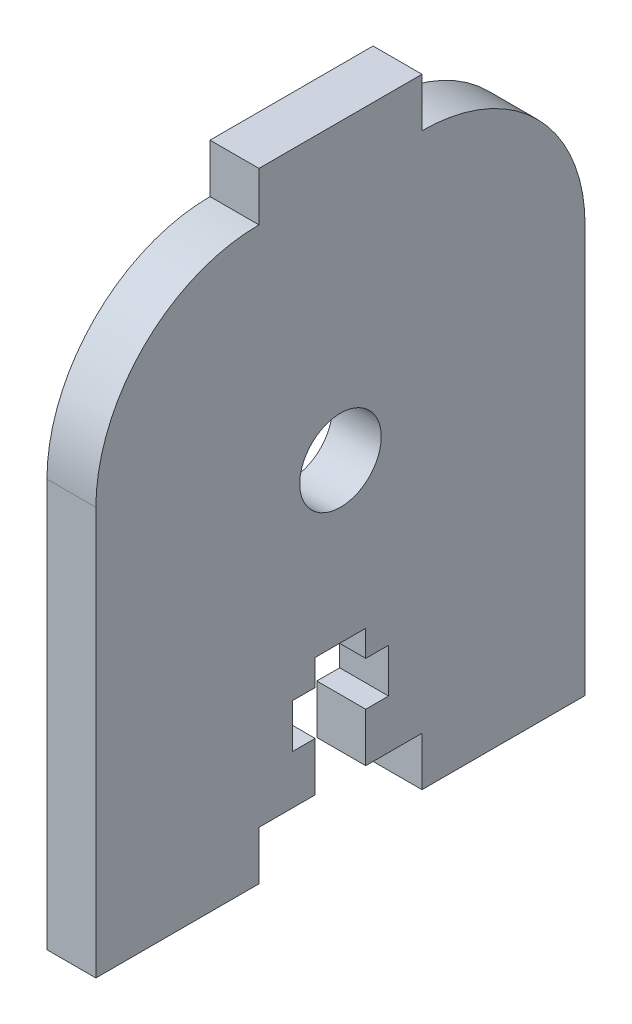
ISO-10303-21;
HEADER;
FILE_DESCRIPTION(('STEP AP214'),'2;1');
FILE_NAME('part.step','',(''),(''),'','','');
FILE_SCHEMA(('AUTOMOTIVE_DESIGN { 1 0 10303 214 1 1 1 1 }'));
ENDSEC;
DATA;
#1=APPLICATION_CONTEXT('core data for automotive mechanical design processes');
#2=APPLICATION_PROTOCOL_DEFINITION('international standard','automotive_design',2000,#1);
#3=PRODUCT_CONTEXT('',#1,'mechanical');
#4=PRODUCT('Part','Part','',(#3));
#5=PRODUCT_RELATED_PRODUCT_CATEGORY('part','',(#4));
#6=PRODUCT_DEFINITION_FORMATION('','',#4);
#7=PRODUCT_DEFINITION_CONTEXT('part definition',#1,'design');
#8=PRODUCT_DEFINITION('design','',#6,#7);
#9=PRODUCT_DEFINITION_SHAPE('','',#8);
#10=(LENGTH_UNIT() NAMED_UNIT(*) SI_UNIT(.MILLI.,.METRE.));
#11=(NAMED_UNIT(*) PLANE_ANGLE_UNIT() SI_UNIT($,.RADIAN.));
#12=(NAMED_UNIT(*) SI_UNIT($,.STERADIAN.) SOLID_ANGLE_UNIT());
#13=UNCERTAINTY_MEASURE_WITH_UNIT(LENGTH_MEASURE(1.E-05),#10,'distance_accuracy_value','');
#14=(GEOMETRIC_REPRESENTATION_CONTEXT(3) GLOBAL_UNCERTAINTY_ASSIGNED_CONTEXT((#13)) GLOBAL_UNIT_ASSIGNED_CONTEXT((#10,
#11,#12)) REPRESENTATION_CONTEXT('',''));
#15=CARTESIAN_POINT('',(0.,0.,0.));
#16=DIRECTION('',(0.,0.,1.));
#17=DIRECTION('',(1.,0.,0.));
#18=AXIS2_PLACEMENT_3D('',#15,#16,#17);
#19=CARTESIAN_POINT('',(0.,3.,-10.));
#20=DIRECTION('',(0.,1.,0.));
#21=DIRECTION('',(0.,0.,1.));
#22=AXIS2_PLACEMENT_3D('',#19,#20,#21);
#23=PLANE('',#22);
#24=DIRECTION('',(0.,0.,1.));
#25=VECTOR('',#24,1.);
#26=CARTESIAN_POINT('',(0.,3.,-10.));
#27=LINE('',#26,#25);
#28=CARTESIAN_POINT('',(0.,3.,-13.45));
#29=VERTEX_POINT('',#28);
#30=CARTESIAN_POINT('',(0.,3.,-10.));
#31=VERTEX_POINT('',#30);
#32=EDGE_CURVE('E328',#29,#31,#27,.T.);
#33=ORIENTED_EDGE('',*,*,#32,.F.);
#34=DIRECTION('',(1.,0.,0.));
#35=VECTOR('',#34,1.);
#36=CARTESIAN_POINT('',(0.,3.,-13.45));
#37=LINE('',#36,#35);
#38=CARTESIAN_POINT('',(3.,3.,-13.45));
#39=VERTEX_POINT('',#38);
#40=EDGE_CURVE('E290',#29,#39,#37,.T.);
#41=ORIENTED_EDGE('',*,*,#40,.T.);
#42=DIRECTION('',(0.,0.,1.));
#43=VECTOR('',#42,1.);
#44=CARTESIAN_POINT('',(3.,3.,-10.));
#45=LINE('',#44,#43);
#46=CARTESIAN_POINT('',(3.,3.,-10.));
#47=VERTEX_POINT('',#46);
#48=EDGE_CURVE('E335',#39,#47,#45,.T.);
#49=ORIENTED_EDGE('',*,*,#48,.T.);
#50=DIRECTION('',(1.,0.,0.));
#51=VECTOR('',#50,1.);
#52=CARTESIAN_POINT('',(0.,3.,-10.));
#53=LINE('',#52,#51);
#54=EDGE_CURVE('E338',#31,#47,#53,.T.);
#55=ORIENTED_EDGE('',*,*,#54,.F.);
#56=EDGE_LOOP('',(#33,#41,#49,#55));
#57=FACE_BOUND('',#56,.T.);
#58=ADVANCED_FACE('F33',(#57),#23,.F.);
#59=CARTESIAN_POINT('',(3.,0.,0.));
#60=DIRECTION('',(-1.,0.,0.));
#61=DIRECTION('',(0.,0.,1.));
#62=AXIS2_PLACEMENT_3D('',#59,#60,#61);
#63=PLANE('',#62);
#64=ORIENTED_EDGE('',*,*,#48,.F.);
#65=DIRECTION('',(0.,-1.,0.));
#66=VECTOR('',#65,1.);
#67=CARTESIAN_POINT('',(3.,3.,-13.45));
#68=LINE('',#67,#66);
#69=CARTESIAN_POINT('',(3.,6.,-13.45));
#70=VERTEX_POINT('',#69);
#71=EDGE_CURVE('E232',#70,#39,#68,.T.);
#72=ORIENTED_EDGE('',*,*,#71,.F.);
#73=DIRECTION('',(0.,0.,-1.));
#74=VECTOR('',#73,1.);
#75=CARTESIAN_POINT('',(3.,6.,-13.45));
#76=LINE('',#75,#74);
#77=CARTESIAN_POINT('',(3.,6.,-12.05));
#78=VERTEX_POINT('',#77);
#79=EDGE_CURVE('E286',#78,#70,#76,.T.);
#80=ORIENTED_EDGE('',*,*,#79,.F.);
#81=DIRECTION('',(0.,-1.,0.));
#82=VECTOR('',#81,1.);
#83=CARTESIAN_POINT('',(3.,6.,-12.05));
#84=LINE('',#83,#82);
#85=CARTESIAN_POINT('',(3.,8.7,-12.05));
#86=VERTEX_POINT('',#85);
#87=EDGE_CURVE('E283',#86,#78,#84,.T.);
#88=ORIENTED_EDGE('',*,*,#87,.F.);
#89=DIRECTION('',(0.,0.,1.));
#90=VECTOR('',#89,1.);
#91=CARTESIAN_POINT('',(3.,8.7,-12.05));
#92=LINE('',#91,#90);
#93=CARTESIAN_POINT('',(3.,8.7,-13.45));
#94=VERTEX_POINT('',#93);
#95=EDGE_CURVE('E280',#94,#86,#92,.T.);
#96=ORIENTED_EDGE('',*,*,#95,.F.);
#97=DIRECTION('',(0.,-1.,0.));
#98=VECTOR('',#97,1.);
#99=CARTESIAN_POINT('',(3.,8.7,-13.45));
#100=LINE('',#99,#98);
#101=CARTESIAN_POINT('',(3.,10.3,-13.45));
#102=VERTEX_POINT('',#101);
#103=EDGE_CURVE('E277',#102,#94,#100,.T.);
#104=ORIENTED_EDGE('',*,*,#103,.F.);
#105=DIRECTION('',(0.,0.,1.));
#106=VECTOR('',#105,1.);
#107=CARTESIAN_POINT('',(3.,10.3,-13.45));
#108=LINE('',#107,#106);
#109=CARTESIAN_POINT('',(3.,10.3,-16.55));
#110=VERTEX_POINT('',#109);
#111=EDGE_CURVE('E274',#110,#102,#108,.T.);
#112=ORIENTED_EDGE('',*,*,#111,.F.);
#113=DIRECTION('',(0.,1.,0.));
#114=VECTOR('',#113,1.);
#115=CARTESIAN_POINT('',(3.,10.3,-16.55));
#116=LINE('',#115,#114);
#117=CARTESIAN_POINT('',(3.,8.7,-16.55));
#118=VERTEX_POINT('',#117);
#119=EDGE_CURVE('E271',#118,#110,#116,.T.);
#120=ORIENTED_EDGE('',*,*,#119,.F.);
#121=DIRECTION('',(0.,0.,1.));
#122=VECTOR('',#121,1.);
#123=CARTESIAN_POINT('',(3.,8.7,-16.55));
#124=LINE('',#123,#122);
#125=CARTESIAN_POINT('',(3.,8.7,-17.95));
#126=VERTEX_POINT('',#125);
#127=EDGE_CURVE('E268',#126,#118,#124,.T.);
#128=ORIENTED_EDGE('',*,*,#127,.F.);
#129=DIRECTION('',(0.,1.,0.));
#130=VECTOR('',#129,1.);
#131=CARTESIAN_POINT('',(3.,8.7,-17.95));
#132=LINE('',#131,#130);
#133=CARTESIAN_POINT('',(3.,6.,-17.95));
#134=VERTEX_POINT('',#133);
#135=EDGE_CURVE('E265',#134,#126,#132,.T.);
#136=ORIENTED_EDGE('',*,*,#135,.F.);
#137=DIRECTION('',(0.,0.,-1.));
#138=VECTOR('',#137,1.);
#139=CARTESIAN_POINT('',(3.,6.,-17.95));
#140=LINE('',#139,#138);
#141=CARTESIAN_POINT('',(3.,6.,-16.55));
#142=VERTEX_POINT('',#141);
#143=EDGE_CURVE('E224',#142,#134,#140,.T.);
#144=ORIENTED_EDGE('',*,*,#143,.F.);
#145=DIRECTION('',(0.,1.,0.));
#146=VECTOR('',#145,1.);
#147=CARTESIAN_POINT('',(3.,6.,-16.55));
#148=LINE('',#147,#146);
#149=CARTESIAN_POINT('',(3.,3.,-16.55));
#150=VERTEX_POINT('',#149);
#151=EDGE_CURVE('E221',#150,#142,#148,.T.);
#152=ORIENTED_EDGE('',*,*,#151,.F.);
#153=CARTESIAN_POINT('',(3.,3.,-20.));
#154=VERTEX_POINT('',#153);
#155=EDGE_CURVE('E325',#154,#150,#45,.T.);
#156=ORIENTED_EDGE('',*,*,#155,.F.);
#157=DIRECTION('',(0.,1.,0.));
#158=VECTOR('',#157,1.);
#159=CARTESIAN_POINT('',(3.,0.,-20.));
#160=LINE('',#159,#158);
#161=CARTESIAN_POINT('',(3.,0.,-20.));
#162=VERTEX_POINT('',#161);
#163=EDGE_CURVE('E332',#162,#154,#160,.T.);
#164=ORIENTED_EDGE('',*,*,#163,.F.);
#165=DIRECTION('',(0.,0.,-1.));
#166=VECTOR('',#165,1.);
#167=CARTESIAN_POINT('',(3.,0.,0.));
#168=LINE('',#167,#166);
#169=CARTESIAN_POINT('',(3.,0.,-30.));
#170=VERTEX_POINT('',#169);
#171=EDGE_CURVE('E350',#162,#170,#168,.T.);
#172=ORIENTED_EDGE('',*,*,#171,.T.);
#173=DIRECTION('',(0.,1.,0.));
#174=VECTOR('',#173,1.);
#175=CARTESIAN_POINT('',(3.,0.,-30.));
#176=LINE('',#175,#174);
#177=CARTESIAN_POINT('',(3.,25.,-30.));
#178=VERTEX_POINT('',#177);
#179=EDGE_CURVE('E355',#170,#178,#176,.T.);
#180=ORIENTED_EDGE('',*,*,#179,.T.);
#181=CARTESIAN_POINT('',(3.,25.,-20.));
#182=DIRECTION('',(-1.,0.,0.));
#183=DIRECTION('',(0.,0.,1.));
#184=AXIS2_PLACEMENT_3D('',#181,#182,#183);
#185=CIRCLE('',#184,10.);
#186=CARTESIAN_POINT('',(3.,35.,-20.));
#187=VERTEX_POINT('',#186);
#188=EDGE_CURVE('E41',#178,#187,#185,.F.);
#189=ORIENTED_EDGE('',*,*,#188,.T.);
#190=DIRECTION('',(0.,-1.,0.));
#191=VECTOR('',#190,1.);
#192=CARTESIAN_POINT('',(3.,38.,-20.));
#193=LINE('',#192,#191);
#194=CARTESIAN_POINT('',(3.,38.,-20.));
#195=VERTEX_POINT('',#194);
#196=EDGE_CURVE('E199',#195,#187,#193,.T.);
#197=ORIENTED_EDGE('',*,*,#196,.F.);
#198=DIRECTION('',(0.,0.,-1.));
#199=VECTOR('',#198,1.);
#200=CARTESIAN_POINT('',(3.,38.,-10.));
#201=LINE('',#200,#199);
#202=CARTESIAN_POINT('',(3.,38.,-10.));
#203=VERTEX_POINT('',#202);
#204=EDGE_CURVE('E205',#203,#195,#201,.T.);
#205=ORIENTED_EDGE('',*,*,#204,.F.);
#206=DIRECTION('',(0.,-1.,0.));
#207=VECTOR('',#206,1.);
#208=CARTESIAN_POINT('',(3.,38.,-10.));
#209=LINE('',#208,#207);
#210=CARTESIAN_POINT('',(3.,35.,-10.));
#211=VERTEX_POINT('',#210);
#212=EDGE_CURVE('E384',#203,#211,#209,.T.);
#213=ORIENTED_EDGE('',*,*,#212,.T.);
#214=CARTESIAN_POINT('',(3.,25.,-10.));
#215=DIRECTION('',(-1.,0.,0.));
#216=DIRECTION('',(0.,0.,1.));
#217=AXIS2_PLACEMENT_3D('',#214,#215,#216);
#218=CIRCLE('',#217,10.);
#219=CARTESIAN_POINT('',(3.,25.,0.));
#220=VERTEX_POINT('',#219);
#221=EDGE_CURVE('E381',#211,#220,#218,.F.);
#222=ORIENTED_EDGE('',*,*,#221,.T.);
#223=DIRECTION('',(0.,-1.,0.));
#224=VECTOR('',#223,1.);
#225=CARTESIAN_POINT('',(3.,0.,0.));
#226=LINE('',#225,#224);
#227=CARTESIAN_POINT('',(3.,0.,0.));
#228=VERTEX_POINT('',#227);
#229=EDGE_CURVE('E348',#220,#228,#226,.T.);
#230=ORIENTED_EDGE('',*,*,#229,.T.);
#231=CARTESIAN_POINT('',(3.,0.,-10.));
#232=VERTEX_POINT('',#231);
#233=EDGE_CURVE('E352',#228,#232,#168,.T.);
#234=ORIENTED_EDGE('',*,*,#233,.T.);
#235=DIRECTION('',(0.,-1.,0.));
#236=VECTOR('',#235,1.);
#237=CARTESIAN_POINT('',(3.,0.,-10.));
#238=LINE('',#237,#236);
#239=EDGE_CURVE('E320',#47,#232,#238,.T.);
#240=ORIENTED_EDGE('',*,*,#239,.F.);
#241=EDGE_LOOP('',(#64,#72,#80,#88,#96,#104,#112,#120,#128,#136,#144,#152,#156,#164,#172,#180,
#189,#197,#205,#213,#222,#230,#234,#240));
#242=FACE_BOUND('',#241,.T.);
#243=CARTESIAN_POINT('',(3.,20.,-15.));
#244=DIRECTION('',(1.,0.,0.));
#245=DIRECTION('',(0.,0.,-1.));
#246=AXIS2_PLACEMENT_3D('',#243,#244,#245);
#247=CIRCLE('',#246,2.5);
#248=CARTESIAN_POINT('',(3.,20.,-17.5));
#249=VERTEX_POINT('',#248);
#250=EDGE_CURVE('E293',#249,#249,#247,.T.);
#251=ORIENTED_EDGE('',*,*,#250,.F.);
#252=EDGE_LOOP('',(#251));
#253=FACE_BOUND('',#252,.T.);
#254=ADVANCED_FACE('F216',(#242,#253),#63,.F.);
#255=CARTESIAN_POINT('',(3.,0.,0.));
#256=DIRECTION('',(0.,1.,0.));
#257=DIRECTION('',(0.,0.,1.));
#258=AXIS2_PLACEMENT_3D('',#255,#256,#257);
#259=PLANE('',#258);
#260=DIRECTION('',(0.,0.,-1.));
#261=VECTOR('',#260,1.);
#262=CARTESIAN_POINT('',(0.,0.,0.));
#263=LINE('',#262,#261);
#264=CARTESIAN_POINT('',(0.,0.,0.));
#265=VERTEX_POINT('',#264);
#266=CARTESIAN_POINT('',(0.,0.,-10.));
#267=VERTEX_POINT('',#266);
#268=EDGE_CURVE('E360',#265,#267,#263,.T.);
#269=ORIENTED_EDGE('',*,*,#268,.T.);
#270=DIRECTION('',(1.,0.,0.));
#271=VECTOR('',#270,1.);
#272=CARTESIAN_POINT('',(0.,0.,-10.));
#273=LINE('',#272,#271);
#274=EDGE_CURVE('E330',#267,#232,#273,.T.);
#275=ORIENTED_EDGE('',*,*,#274,.T.);
#276=ORIENTED_EDGE('',*,*,#233,.F.);
#277=DIRECTION('',(-1.,0.,0.));
#278=VECTOR('',#277,1.);
#279=CARTESIAN_POINT('',(3.,0.,0.));
#280=LINE('',#279,#278);
#281=EDGE_CURVE('E367',#228,#265,#280,.T.);
#282=ORIENTED_EDGE('',*,*,#281,.T.);
#283=EDGE_LOOP('',(#269,#275,#276,#282));
#284=FACE_BOUND('',#283,.T.);
#285=ADVANCED_FACE('F400',(#284),#259,.F.);
#286=CARTESIAN_POINT('',(3.,0.,0.));
#287=DIRECTION('',(0.,0.,-1.));
#288=DIRECTION('',(-1.,0.,0.));
#289=AXIS2_PLACEMENT_3D('',#286,#287,#288);
#290=PLANE('',#289);
#291=ORIENTED_EDGE('',*,*,#229,.F.);
#292=DIRECTION('',(-1.,0.,0.));
#293=VECTOR('',#292,1.);
#294=CARTESIAN_POINT('',(3.,25.,0.));
#295=LINE('',#294,#293);
#296=CARTESIAN_POINT('',(0.,25.,0.));
#297=VERTEX_POINT('',#296);
#298=EDGE_CURVE('E11',#220,#297,#295,.T.);
#299=ORIENTED_EDGE('',*,*,#298,.T.);
#300=DIRECTION('',(0.,-1.,0.));
#301=VECTOR('',#300,1.);
#302=CARTESIAN_POINT('',(0.,0.,0.));
#303=LINE('',#302,#301);
#304=EDGE_CURVE('E341',#297,#265,#303,.T.);
#305=ORIENTED_EDGE('',*,*,#304,.T.);
#306=ORIENTED_EDGE('',*,*,#281,.F.);
#307=EDGE_LOOP('',(#291,#299,#305,#306));
#308=FACE_BOUND('',#307,.T.);
#309=ADVANCED_FACE('F390',(#308),#290,.F.);
#310=ORIENTED_EDGE('',*,*,#171,.F.);
#311=DIRECTION('',(1.,0.,0.));
#312=VECTOR('',#311,1.);
#313=CARTESIAN_POINT('',(0.,0.,-20.));
#314=LINE('',#313,#312);
#315=CARTESIAN_POINT('',(0.,0.,-20.));
#316=VERTEX_POINT('',#315);
#317=EDGE_CURVE('E344',#316,#162,#314,.T.);
#318=ORIENTED_EDGE('',*,*,#317,.F.);
#319=CARTESIAN_POINT('',(0.,0.,-30.));
#320=VERTEX_POINT('',#319);
#321=EDGE_CURVE('E359',#316,#320,#263,.T.);
#322=ORIENTED_EDGE('',*,*,#321,.T.);
#323=DIRECTION('',(-1.,0.,0.));
#324=VECTOR('',#323,1.);
#325=CARTESIAN_POINT('',(3.,0.,-30.));
#326=LINE('',#325,#324);
#327=EDGE_CURVE('E357',#170,#320,#326,.T.);
#328=ORIENTED_EDGE('',*,*,#327,.F.);
#329=EDGE_LOOP('',(#310,#318,#322,#328));
#330=FACE_BOUND('',#329,.T.);
#331=ADVANCED_FACE('F458',(#330),#259,.F.);
#332=CARTESIAN_POINT('',(3.,0.,-30.));
#333=DIRECTION('',(0.,0.,1.));
#334=DIRECTION('',(1.,0.,0.));
#335=AXIS2_PLACEMENT_3D('',#332,#333,#334);
#336=PLANE('',#335);
#337=DIRECTION('',(0.,1.,0.));
#338=VECTOR('',#337,1.);
#339=CARTESIAN_POINT('',(0.,0.,-30.));
#340=LINE('',#339,#338);
#341=CARTESIAN_POINT('',(0.,25.,-30.));
#342=VERTEX_POINT('',#341);
#343=EDGE_CURVE('E351',#320,#342,#340,.T.);
#344=ORIENTED_EDGE('',*,*,#343,.T.);
#345=DIRECTION('',(-1.,0.,0.));
#346=VECTOR('',#345,1.);
#347=CARTESIAN_POINT('',(3.,25.,-30.));
#348=LINE('',#347,#346);
#349=EDGE_CURVE('E379',#342,#178,#348,.F.);
#350=ORIENTED_EDGE('',*,*,#349,.T.);
#351=ORIENTED_EDGE('',*,*,#179,.F.);
#352=ORIENTED_EDGE('',*,*,#327,.T.);
#353=EDGE_LOOP('',(#344,#350,#351,#352));
#354=FACE_BOUND('',#353,.T.);
#355=ADVANCED_FACE('F463',(#354),#336,.F.);
#356=CARTESIAN_POINT('',(0.,0.,0.));
#357=DIRECTION('',(-1.,0.,0.));
#358=DIRECTION('',(0.,0.,1.));
#359=AXIS2_PLACEMENT_3D('',#356,#357,#358);
#360=PLANE('',#359);
#361=DIRECTION('',(0.,-1.,0.));
#362=VECTOR('',#361,1.);
#363=CARTESIAN_POINT('',(0.,3.,-13.45));
#364=LINE('',#363,#362);
#365=CARTESIAN_POINT('',(0.,6.,-13.45));
#366=VERTEX_POINT('',#365);
#367=EDGE_CURVE('E259',#366,#29,#364,.T.);
#368=ORIENTED_EDGE('',*,*,#367,.T.);
#369=ORIENTED_EDGE('',*,*,#32,.T.);
#370=DIRECTION('',(0.,-1.,0.));
#371=VECTOR('',#370,1.);
#372=CARTESIAN_POINT('',(0.,0.,-10.));
#373=LINE('',#372,#371);
#374=EDGE_CURVE('E321',#31,#267,#373,.T.);
#375=ORIENTED_EDGE('',*,*,#374,.T.);
#376=ORIENTED_EDGE('',*,*,#268,.F.);
#377=ORIENTED_EDGE('',*,*,#304,.F.);
#378=CARTESIAN_POINT('',(0.,25.,-10.));
#379=DIRECTION('',(-1.,0.,0.));
#380=DIRECTION('',(0.,0.,1.));
#381=AXIS2_PLACEMENT_3D('',#378,#379,#380);
#382=CIRCLE('',#381,10.);
#383=CARTESIAN_POINT('',(0.,35.,-10.));
#384=VERTEX_POINT('',#383);
#385=EDGE_CURVE('E375',#297,#384,#382,.T.);
#386=ORIENTED_EDGE('',*,*,#385,.T.);
#387=DIRECTION('',(0.,-1.,0.));
#388=VECTOR('',#387,1.);
#389=CARTESIAN_POINT('',(0.,38.,-10.));
#390=LINE('',#389,#388);
#391=CARTESIAN_POINT('',(0.,38.,-10.));
#392=VERTEX_POINT('',#391);
#393=EDGE_CURVE('E226',#392,#384,#390,.T.);
#394=ORIENTED_EDGE('',*,*,#393,.F.);
#395=DIRECTION('',(0.,0.,1.));
#396=VECTOR('',#395,1.);
#397=CARTESIAN_POINT('',(0.,38.,-10.));
#398=LINE('',#397,#396);
#399=CARTESIAN_POINT('',(0.,38.,-20.));
#400=VERTEX_POINT('',#399);
#401=EDGE_CURVE('E204',#400,#392,#398,.T.);
#402=ORIENTED_EDGE('',*,*,#401,.F.);
#403=DIRECTION('',(0.,-1.,0.));
#404=VECTOR('',#403,1.);
#405=CARTESIAN_POINT('',(0.,38.,-20.));
#406=LINE('',#405,#404);
#407=CARTESIAN_POINT('',(0.,35.,-20.));
#408=VERTEX_POINT('',#407);
#409=EDGE_CURVE('E201',#400,#408,#406,.T.);
#410=ORIENTED_EDGE('',*,*,#409,.T.);
#411=CARTESIAN_POINT('',(0.,25.,-20.));
#412=DIRECTION('',(-1.,0.,0.));
#413=DIRECTION('',(0.,0.,1.));
#414=AXIS2_PLACEMENT_3D('',#411,#412,#413);
#415=CIRCLE('',#414,10.);
#416=EDGE_CURVE('E377',#408,#342,#415,.T.);
#417=ORIENTED_EDGE('',*,*,#416,.T.);
#418=ORIENTED_EDGE('',*,*,#343,.F.);
#419=ORIENTED_EDGE('',*,*,#321,.F.);
#420=DIRECTION('',(0.,1.,0.));
#421=VECTOR('',#420,1.);
#422=CARTESIAN_POINT('',(0.,0.,-20.));
#423=LINE('',#422,#421);
#424=CARTESIAN_POINT('',(0.,3.,-20.));
#425=VERTEX_POINT('',#424);
#426=EDGE_CURVE('E324',#316,#425,#423,.T.);
#427=ORIENTED_EDGE('',*,*,#426,.T.);
#428=CARTESIAN_POINT('',(0.,3.,-16.55));
#429=VERTEX_POINT('',#428);
#430=EDGE_CURVE('E55',#425,#429,#27,.T.);
#431=ORIENTED_EDGE('',*,*,#430,.T.);
#432=DIRECTION('',(0.,1.,0.));
#433=VECTOR('',#432,1.);
#434=CARTESIAN_POINT('',(0.,6.,-16.55));
#435=LINE('',#434,#433);
#436=CARTESIAN_POINT('',(0.,6.,-16.55));
#437=VERTEX_POINT('',#436);
#438=EDGE_CURVE('E48',#429,#437,#435,.T.);
#439=ORIENTED_EDGE('',*,*,#438,.T.);
#440=DIRECTION('',(0.,0.,-1.));
#441=VECTOR('',#440,1.);
#442=CARTESIAN_POINT('',(0.,6.,-17.95));
#443=LINE('',#442,#441);
#444=CARTESIAN_POINT('',(0.,6.,-17.95));
#445=VERTEX_POINT('',#444);
#446=EDGE_CURVE('E231',#437,#445,#443,.T.);
#447=ORIENTED_EDGE('',*,*,#446,.T.);
#448=DIRECTION('',(0.,1.,0.));
#449=VECTOR('',#448,1.);
#450=CARTESIAN_POINT('',(0.,8.7,-17.95));
#451=LINE('',#450,#449);
#452=CARTESIAN_POINT('',(0.,8.7,-17.95));
#453=VERTEX_POINT('',#452);
#454=EDGE_CURVE('E235',#445,#453,#451,.T.);
#455=ORIENTED_EDGE('',*,*,#454,.T.);
#456=DIRECTION('',(0.,0.,1.));
#457=VECTOR('',#456,1.);
#458=CARTESIAN_POINT('',(0.,8.7,-16.55));
#459=LINE('',#458,#457);
#460=CARTESIAN_POINT('',(0.,8.7,-16.55));
#461=VERTEX_POINT('',#460);
#462=EDGE_CURVE('E238',#453,#461,#459,.T.);
#463=ORIENTED_EDGE('',*,*,#462,.T.);
#464=DIRECTION('',(0.,1.,0.));
#465=VECTOR('',#464,1.);
#466=CARTESIAN_POINT('',(0.,10.3,-16.55));
#467=LINE('',#466,#465);
#468=CARTESIAN_POINT('',(0.,10.3,-16.55));
#469=VERTEX_POINT('',#468);
#470=EDGE_CURVE('E241',#461,#469,#467,.T.);
#471=ORIENTED_EDGE('',*,*,#470,.T.);
#472=DIRECTION('',(0.,0.,1.));
#473=VECTOR('',#472,1.);
#474=CARTESIAN_POINT('',(0.,10.3,-13.45));
#475=LINE('',#474,#473);
#476=CARTESIAN_POINT('',(0.,10.3,-13.45));
#477=VERTEX_POINT('',#476);
#478=EDGE_CURVE('E244',#469,#477,#475,.T.);
#479=ORIENTED_EDGE('',*,*,#478,.T.);
#480=DIRECTION('',(0.,-1.,0.));
#481=VECTOR('',#480,1.);
#482=CARTESIAN_POINT('',(0.,8.7,-13.45));
#483=LINE('',#482,#481);
#484=CARTESIAN_POINT('',(0.,8.7,-13.45));
#485=VERTEX_POINT('',#484);
#486=EDGE_CURVE('E247',#477,#485,#483,.T.);
#487=ORIENTED_EDGE('',*,*,#486,.T.);
#488=DIRECTION('',(0.,0.,1.));
#489=VECTOR('',#488,1.);
#490=CARTESIAN_POINT('',(0.,8.7,-12.05));
#491=LINE('',#490,#489);
#492=CARTESIAN_POINT('',(0.,8.7,-12.05));
#493=VERTEX_POINT('',#492);
#494=EDGE_CURVE('E250',#485,#493,#491,.T.);
#495=ORIENTED_EDGE('',*,*,#494,.T.);
#496=DIRECTION('',(0.,-1.,0.));
#497=VECTOR('',#496,1.);
#498=CARTESIAN_POINT('',(0.,6.,-12.05));
#499=LINE('',#498,#497);
#500=CARTESIAN_POINT('',(0.,6.,-12.05));
#501=VERTEX_POINT('',#500);
#502=EDGE_CURVE('E253',#493,#501,#499,.T.);
#503=ORIENTED_EDGE('',*,*,#502,.T.);
#504=DIRECTION('',(0.,0.,-1.));
#505=VECTOR('',#504,1.);
#506=CARTESIAN_POINT('',(0.,6.,-13.45));
#507=LINE('',#506,#505);
#508=EDGE_CURVE('E256',#501,#366,#507,.T.);
#509=ORIENTED_EDGE('',*,*,#508,.T.);
#510=EDGE_LOOP('',(#368,#369,#375,#376,#377,#386,#394,#402,#410,#417,#418,#419,#427,#431,#439,
#447,#455,#463,#471,#479,#487,#495,#503,#509));
#511=FACE_BOUND('',#510,.T.);
#512=CARTESIAN_POINT('',(0.,20.,-15.));
#513=DIRECTION('',(1.,0.,0.));
#514=DIRECTION('',(0.,0.,-1.));
#515=AXIS2_PLACEMENT_3D('',#512,#513,#514);
#516=CIRCLE('',#515,2.5);
#517=CARTESIAN_POINT('',(0.,20.,-17.5));
#518=VERTEX_POINT('',#517);
#519=EDGE_CURVE('E317',#518,#518,#516,.T.);
#520=ORIENTED_EDGE('',*,*,#519,.T.);
#521=EDGE_LOOP('',(#520));
#522=FACE_BOUND('',#521,.T.);
#523=ADVANCED_FACE('F395',(#511,#522),#360,.T.);
#524=CARTESIAN_POINT('',(3.,25.,-20.));
#525=DIRECTION('',(-1.,0.,0.));
#526=DIRECTION('',(0.,0.,1.));
#527=AXIS2_PLACEMENT_3D('',#524,#525,#526);
#528=CYLINDRICAL_SURFACE('',#527,10.);
#529=ORIENTED_EDGE('',*,*,#188,.F.);
#530=ORIENTED_EDGE('',*,*,#349,.F.);
#531=ORIENTED_EDGE('',*,*,#416,.F.);
#532=DIRECTION('',(-1.,0.,0.));
#533=VECTOR('',#532,1.);
#534=CARTESIAN_POINT('',(3.,35.,-20.));
#535=LINE('',#534,#533);
#536=EDGE_CURVE('E373',#187,#408,#535,.T.);
#537=ORIENTED_EDGE('',*,*,#536,.F.);
#538=EDGE_LOOP('',(#529,#530,#531,#537));
#539=FACE_BOUND('',#538,.T.);
#540=ADVANCED_FACE('F466',(#539),#528,.T.);
#541=CARTESIAN_POINT('',(3.,25.,-10.));
#542=DIRECTION('',(-1.,0.,0.));
#543=DIRECTION('',(0.,0.,1.));
#544=AXIS2_PLACEMENT_3D('',#541,#542,#543);
#545=CYLINDRICAL_SURFACE('',#544,10.);
#546=ORIENTED_EDGE('',*,*,#221,.F.);
#547=DIRECTION('',(-1.,0.,0.));
#548=VECTOR('',#547,1.);
#549=CARTESIAN_POINT('',(3.,35.,-10.));
#550=LINE('',#549,#548);
#551=EDGE_CURVE('E370',#384,#211,#550,.F.);
#552=ORIENTED_EDGE('',*,*,#551,.F.);
#553=ORIENTED_EDGE('',*,*,#385,.F.);
#554=ORIENTED_EDGE('',*,*,#298,.F.);
#555=EDGE_LOOP('',(#546,#552,#553,#554));
#556=FACE_BOUND('',#555,.T.);
#557=ADVANCED_FACE('F35',(#556),#545,.T.);
#558=CARTESIAN_POINT('',(0.,0.,-10.));
#559=DIRECTION('',(0.,0.,1.));
#560=DIRECTION('',(1.,0.,0.));
#561=AXIS2_PLACEMENT_3D('',#558,#559,#560);
#562=PLANE('',#561);
#563=ORIENTED_EDGE('',*,*,#239,.T.);
#564=ORIENTED_EDGE('',*,*,#274,.F.);
#565=ORIENTED_EDGE('',*,*,#374,.F.);
#566=ORIENTED_EDGE('',*,*,#54,.T.);
#567=EDGE_LOOP('',(#563,#564,#565,#566));
#568=FACE_BOUND('',#567,.T.);
#569=ADVANCED_FACE('F404',(#568),#562,.F.);
#570=ORIENTED_EDGE('',*,*,#155,.T.);
#571=DIRECTION('',(1.,0.,0.));
#572=VECTOR('',#571,1.);
#573=CARTESIAN_POINT('',(0.,3.,-16.55));
#574=LINE('',#573,#572);
#575=EDGE_CURVE('E261',#429,#150,#574,.T.);
#576=ORIENTED_EDGE('',*,*,#575,.F.);
#577=ORIENTED_EDGE('',*,*,#430,.F.);
#578=DIRECTION('',(1.,0.,0.));
#579=VECTOR('',#578,1.);
#580=CARTESIAN_POINT('',(0.,3.,-20.));
#581=LINE('',#580,#579);
#582=EDGE_CURVE('E342',#425,#154,#581,.T.);
#583=ORIENTED_EDGE('',*,*,#582,.T.);
#584=EDGE_LOOP('',(#570,#576,#577,#583));
#585=FACE_BOUND('',#584,.T.);
#586=ADVANCED_FACE('F451',(#585),#23,.F.);
#587=CARTESIAN_POINT('',(0.,0.,-20.));
#588=DIRECTION('',(0.,0.,-1.));
#589=DIRECTION('',(-1.,0.,0.));
#590=AXIS2_PLACEMENT_3D('',#587,#588,#589);
#591=PLANE('',#590);
#592=ORIENTED_EDGE('',*,*,#163,.T.);
#593=ORIENTED_EDGE('',*,*,#582,.F.);
#594=ORIENTED_EDGE('',*,*,#426,.F.);
#595=ORIENTED_EDGE('',*,*,#317,.T.);
#596=EDGE_LOOP('',(#592,#593,#594,#595));
#597=FACE_BOUND('',#596,.T.);
#598=ADVANCED_FACE('F453',(#597),#591,.F.);
#599=CARTESIAN_POINT('',(3.,20.,-15.));
#600=DIRECTION('',(1.,0.,0.));
#601=DIRECTION('',(0.,0.,-1.));
#602=AXIS2_PLACEMENT_3D('',#599,#600,#601);
#603=CYLINDRICAL_SURFACE('',#602,2.5);
#604=ORIENTED_EDGE('',*,*,#519,.F.);
#605=EDGE_LOOP('',(#604));
#606=FACE_BOUND('',#605,.T.);
#607=ORIENTED_EDGE('',*,*,#250,.T.);
#608=EDGE_LOOP('',(#607));
#609=FACE_BOUND('',#608,.T.);
#610=ADVANCED_FACE('F493',(#606,#609),#603,.F.);
#611=CARTESIAN_POINT('',(0.,3.,-13.45));
#612=DIRECTION('',(0.,0.,1.));
#613=DIRECTION('',(1.,0.,0.));
#614=AXIS2_PLACEMENT_3D('',#611,#612,#613);
#615=PLANE('',#614);
#616=ORIENTED_EDGE('',*,*,#71,.T.);
#617=ORIENTED_EDGE('',*,*,#40,.F.);
#618=ORIENTED_EDGE('',*,*,#367,.F.);
#619=DIRECTION('',(1.,0.,0.));
#620=VECTOR('',#619,1.);
#621=CARTESIAN_POINT('',(0.,6.,-13.45));
#622=LINE('',#621,#620);
#623=EDGE_CURVE('E294',#366,#70,#622,.T.);
#624=ORIENTED_EDGE('',*,*,#623,.T.);
#625=EDGE_LOOP('',(#616,#617,#618,#624));
#626=FACE_BOUND('',#625,.T.);
#627=ADVANCED_FACE('F410',(#626),#615,.F.);
#628=CARTESIAN_POINT('',(0.,6.,-13.45));
#629=DIRECTION('',(0.,-1.,0.));
#630=DIRECTION('',(0.,0.,-1.));
#631=AXIS2_PLACEMENT_3D('',#628,#629,#630);
#632=PLANE('',#631);
#633=ORIENTED_EDGE('',*,*,#79,.T.);
#634=ORIENTED_EDGE('',*,*,#623,.F.);
#635=ORIENTED_EDGE('',*,*,#508,.F.);
#636=DIRECTION('',(1.,0.,0.));
#637=VECTOR('',#636,1.);
#638=CARTESIAN_POINT('',(0.,6.,-12.05));
#639=LINE('',#638,#637);
#640=EDGE_CURVE('E296',#501,#78,#639,.T.);
#641=ORIENTED_EDGE('',*,*,#640,.T.);
#642=EDGE_LOOP('',(#633,#634,#635,#641));
#643=FACE_BOUND('',#642,.T.);
#644=ADVANCED_FACE('F414',(#643),#632,.F.);
#645=CARTESIAN_POINT('',(0.,6.,-12.05));
#646=DIRECTION('',(0.,0.,1.));
#647=DIRECTION('',(0.,-1.,0.));
#648=AXIS2_PLACEMENT_3D('',#645,#646,#647);
#649=PLANE('',#648);
#650=ORIENTED_EDGE('',*,*,#87,.T.);
#651=ORIENTED_EDGE('',*,*,#640,.F.);
#652=ORIENTED_EDGE('',*,*,#502,.F.);
#653=DIRECTION('',(1.,0.,0.));
#654=VECTOR('',#653,1.);
#655=CARTESIAN_POINT('',(0.,8.7,-12.05));
#656=LINE('',#655,#654);
#657=EDGE_CURVE('E298',#493,#86,#656,.T.);
#658=ORIENTED_EDGE('',*,*,#657,.T.);
#659=EDGE_LOOP('',(#650,#651,#652,#658));
#660=FACE_BOUND('',#659,.T.);
#661=ADVANCED_FACE('F420',(#660),#649,.F.);
#662=CARTESIAN_POINT('',(0.,8.7,-12.05));
#663=DIRECTION('',(0.,1.,0.));
#664=DIRECTION('',(0.,0.,1.));
#665=AXIS2_PLACEMENT_3D('',#662,#663,#664);
#666=PLANE('',#665);
#667=ORIENTED_EDGE('',*,*,#95,.T.);
#668=ORIENTED_EDGE('',*,*,#657,.F.);
#669=ORIENTED_EDGE('',*,*,#494,.F.);
#670=DIRECTION('',(1.,0.,0.));
#671=VECTOR('',#670,1.);
#672=CARTESIAN_POINT('',(0.,8.7,-13.45));
#673=LINE('',#672,#671);
#674=EDGE_CURVE('E300',#485,#94,#673,.T.);
#675=ORIENTED_EDGE('',*,*,#674,.T.);
#676=EDGE_LOOP('',(#667,#668,#669,#675));
#677=FACE_BOUND('',#676,.T.);
#678=ADVANCED_FACE('F423',(#677),#666,.F.);
#679=CARTESIAN_POINT('',(0.,8.7,-13.45));
#680=DIRECTION('',(0.,0.,1.));
#681=DIRECTION('',(0.,-1.,0.));
#682=AXIS2_PLACEMENT_3D('',#679,#680,#681);
#683=PLANE('',#682);
#684=ORIENTED_EDGE('',*,*,#103,.T.);
#685=ORIENTED_EDGE('',*,*,#674,.F.);
#686=ORIENTED_EDGE('',*,*,#486,.F.);
#687=DIRECTION('',(1.,0.,0.));
#688=VECTOR('',#687,1.);
#689=CARTESIAN_POINT('',(0.,10.3,-13.45));
#690=LINE('',#689,#688);
#691=EDGE_CURVE('E302',#477,#102,#690,.T.);
#692=ORIENTED_EDGE('',*,*,#691,.T.);
#693=EDGE_LOOP('',(#684,#685,#686,#692));
#694=FACE_BOUND('',#693,.T.);
#695=ADVANCED_FACE('F426',(#694),#683,.F.);
#696=CARTESIAN_POINT('',(0.,10.3,-13.45));
#697=DIRECTION('',(0.,1.,0.));
#698=DIRECTION('',(0.,0.,1.));
#699=AXIS2_PLACEMENT_3D('',#696,#697,#698);
#700=PLANE('',#699);
#701=ORIENTED_EDGE('',*,*,#111,.T.);
#702=ORIENTED_EDGE('',*,*,#691,.F.);
#703=ORIENTED_EDGE('',*,*,#478,.F.);
#704=DIRECTION('',(1.,0.,0.));
#705=VECTOR('',#704,1.);
#706=CARTESIAN_POINT('',(0.,10.3,-16.55));
#707=LINE('',#706,#705);
#708=EDGE_CURVE('E304',#469,#110,#707,.T.);
#709=ORIENTED_EDGE('',*,*,#708,.T.);
#710=EDGE_LOOP('',(#701,#702,#703,#709));
#711=FACE_BOUND('',#710,.T.);
#712=ADVANCED_FACE('F431',(#711),#700,.F.);
#713=CARTESIAN_POINT('',(0.,10.3,-16.55));
#714=DIRECTION('',(0.,0.,-1.));
#715=DIRECTION('',(0.,1.,0.));
#716=AXIS2_PLACEMENT_3D('',#713,#714,#715);
#717=PLANE('',#716);
#718=ORIENTED_EDGE('',*,*,#119,.T.);
#719=ORIENTED_EDGE('',*,*,#708,.F.);
#720=ORIENTED_EDGE('',*,*,#470,.F.);
#721=DIRECTION('',(1.,0.,0.));
#722=VECTOR('',#721,1.);
#723=CARTESIAN_POINT('',(0.,8.7,-16.55));
#724=LINE('',#723,#722);
#725=EDGE_CURVE('E306',#461,#118,#724,.T.);
#726=ORIENTED_EDGE('',*,*,#725,.T.);
#727=EDGE_LOOP('',(#718,#719,#720,#726));
#728=FACE_BOUND('',#727,.T.);
#729=ADVANCED_FACE('F435',(#728),#717,.F.);
#730=CARTESIAN_POINT('',(0.,8.7,-16.55));
#731=DIRECTION('',(0.,1.,0.));
#732=DIRECTION('',(0.,0.,1.));
#733=AXIS2_PLACEMENT_3D('',#730,#731,#732);
#734=PLANE('',#733);
#735=ORIENTED_EDGE('',*,*,#127,.T.);
#736=ORIENTED_EDGE('',*,*,#725,.F.);
#737=ORIENTED_EDGE('',*,*,#462,.F.);
#738=DIRECTION('',(1.,0.,0.));
#739=VECTOR('',#738,1.);
#740=CARTESIAN_POINT('',(0.,8.7,-17.95));
#741=LINE('',#740,#739);
#742=EDGE_CURVE('E308',#453,#126,#741,.T.);
#743=ORIENTED_EDGE('',*,*,#742,.T.);
#744=EDGE_LOOP('',(#735,#736,#737,#743));
#745=FACE_BOUND('',#744,.T.);
#746=ADVANCED_FACE('F438',(#745),#734,.F.);
#747=CARTESIAN_POINT('',(0.,8.7,-17.95));
#748=DIRECTION('',(0.,0.,-1.));
#749=DIRECTION('',(-1.,0.,0.));
#750=AXIS2_PLACEMENT_3D('',#747,#748,#749);
#751=PLANE('',#750);
#752=ORIENTED_EDGE('',*,*,#135,.T.);
#753=ORIENTED_EDGE('',*,*,#742,.F.);
#754=ORIENTED_EDGE('',*,*,#454,.F.);
#755=DIRECTION('',(1.,0.,0.));
#756=VECTOR('',#755,1.);
#757=CARTESIAN_POINT('',(0.,6.,-17.95));
#758=LINE('',#757,#756);
#759=EDGE_CURVE('E310',#445,#134,#758,.T.);
#760=ORIENTED_EDGE('',*,*,#759,.T.);
#761=EDGE_LOOP('',(#752,#753,#754,#760));
#762=FACE_BOUND('',#761,.T.);
#763=ADVANCED_FACE('F443',(#762),#751,.F.);
#764=CARTESIAN_POINT('',(0.,6.,-17.95));
#765=DIRECTION('',(0.,-1.,0.));
#766=DIRECTION('',(0.,0.,-1.));
#767=AXIS2_PLACEMENT_3D('',#764,#765,#766);
#768=PLANE('',#767);
#769=ORIENTED_EDGE('',*,*,#143,.T.);
#770=ORIENTED_EDGE('',*,*,#759,.F.);
#771=ORIENTED_EDGE('',*,*,#446,.F.);
#772=DIRECTION('',(1.,0.,0.));
#773=VECTOR('',#772,1.);
#774=CARTESIAN_POINT('',(0.,6.,-16.55));
#775=LINE('',#774,#773);
#776=EDGE_CURVE('E312',#437,#142,#775,.T.);
#777=ORIENTED_EDGE('',*,*,#776,.T.);
#778=EDGE_LOOP('',(#769,#770,#771,#777));
#779=FACE_BOUND('',#778,.T.);
#780=ADVANCED_FACE('F447',(#779),#768,.F.);
#781=CARTESIAN_POINT('',(0.,6.,-16.55));
#782=DIRECTION('',(0.,0.,-1.));
#783=DIRECTION('',(-1.,0.,0.));
#784=AXIS2_PLACEMENT_3D('',#781,#782,#783);
#785=PLANE('',#784);
#786=ORIENTED_EDGE('',*,*,#151,.T.);
#787=ORIENTED_EDGE('',*,*,#776,.F.);
#788=ORIENTED_EDGE('',*,*,#438,.F.);
#789=ORIENTED_EDGE('',*,*,#575,.T.);
#790=EDGE_LOOP('',(#786,#787,#788,#789));
#791=FACE_BOUND('',#790,.T.);
#792=ADVANCED_FACE('F448',(#791),#785,.F.);
#793=CARTESIAN_POINT('',(3.,38.,-20.));
#794=DIRECTION('',(0.,0.,1.));
#795=DIRECTION('',(1.,0.,0.));
#796=AXIS2_PLACEMENT_3D('',#793,#794,#795);
#797=PLANE('',#796);
#798=ORIENTED_EDGE('',*,*,#536,.T.);
#799=ORIENTED_EDGE('',*,*,#409,.F.);
#800=DIRECTION('',(-1.,0.,0.));
#801=VECTOR('',#800,1.);
#802=CARTESIAN_POINT('',(3.,38.,-20.));
#803=LINE('',#802,#801);
#804=EDGE_CURVE('E194',#195,#400,#803,.T.);
#805=ORIENTED_EDGE('',*,*,#804,.F.);
#806=ORIENTED_EDGE('',*,*,#196,.T.);
#807=EDGE_LOOP('',(#798,#799,#805,#806));
#808=FACE_BOUND('',#807,.T.);
#809=ADVANCED_FACE('F197',(#808),#797,.F.);
#810=CARTESIAN_POINT('',(3.,38.,-10.));
#811=DIRECTION('',(0.,0.,-1.));
#812=DIRECTION('',(-1.,0.,0.));
#813=AXIS2_PLACEMENT_3D('',#810,#811,#812);
#814=PLANE('',#813);
#815=ORIENTED_EDGE('',*,*,#551,.T.);
#816=ORIENTED_EDGE('',*,*,#212,.F.);
#817=DIRECTION('',(1.,0.,0.));
#818=VECTOR('',#817,1.);
#819=CARTESIAN_POINT('',(3.,38.,-10.));
#820=LINE('',#819,#818);
#821=EDGE_CURVE('E210',#392,#203,#820,.T.);
#822=ORIENTED_EDGE('',*,*,#821,.F.);
#823=ORIENTED_EDGE('',*,*,#393,.T.);
#824=EDGE_LOOP('',(#815,#816,#822,#823));
#825=FACE_BOUND('',#824,.T.);
#826=ADVANCED_FACE('F471',(#825),#814,.F.);
#827=CARTESIAN_POINT('',(0.,38.,0.));
#828=DIRECTION('',(0.,1.,0.));
#829=DIRECTION('',(0.,0.,1.));
#830=AXIS2_PLACEMENT_3D('',#827,#828,#829);
#831=PLANE('',#830);
#832=ORIENTED_EDGE('',*,*,#204,.T.);
#833=ORIENTED_EDGE('',*,*,#804,.T.);
#834=ORIENTED_EDGE('',*,*,#401,.T.);
#835=ORIENTED_EDGE('',*,*,#821,.T.);
#836=EDGE_LOOP('',(#832,#833,#834,#835));
#837=FACE_BOUND('',#836,.T.);
#838=ADVANCED_FACE('F208',(#837),#831,.T.);
#839=CLOSED_SHELL('',(#58,#254,#285,#309,#331,#355,#523,#540,#557,#569,#586,#598,#610,#627,#644,
#661,#678,#695,#712,#729,#746,#763,#780,#792,#809,#826,#838));
#840=MANIFOLD_SOLID_BREP('B2',#839);
#841=ADVANCED_BREP_SHAPE_REPRESENTATION('',(#18,#840),#14);
#842=SHAPE_DEFINITION_REPRESENTATION(#9,#841);
ENDSEC;
END-ISO-10303-21;
